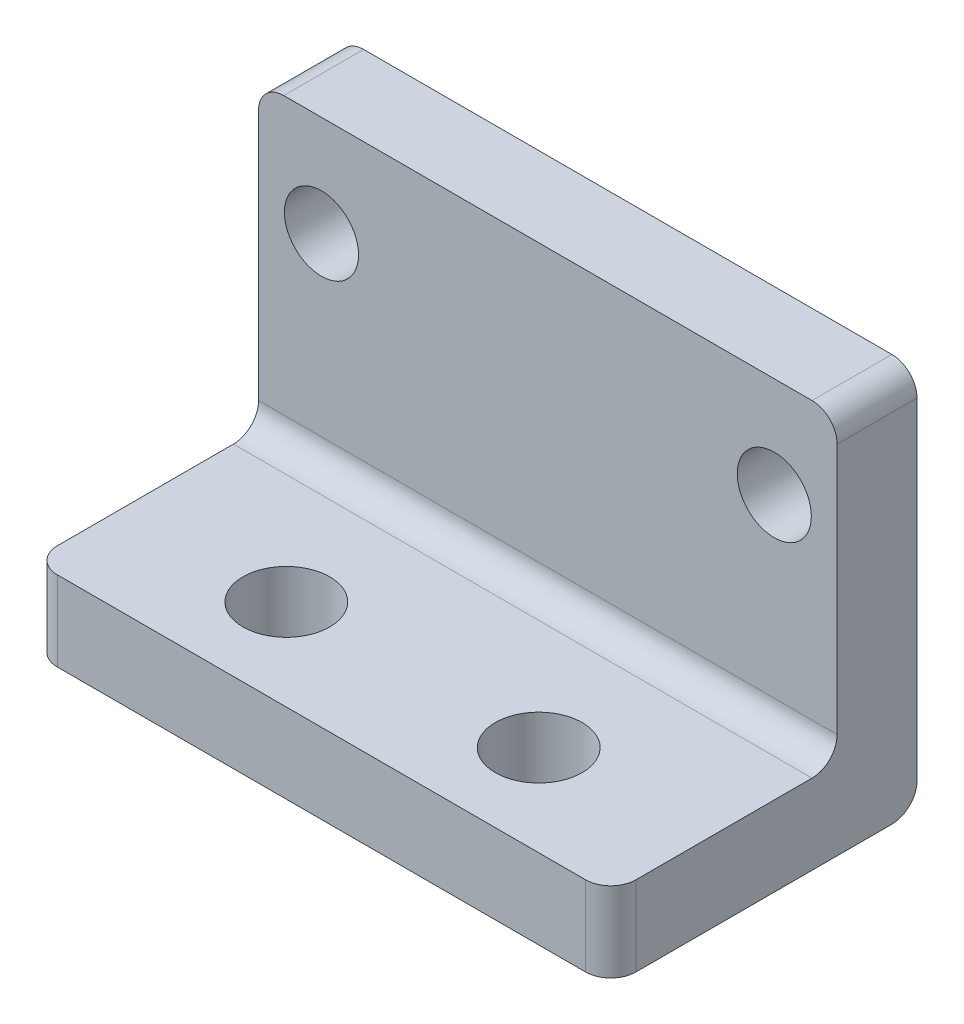
ISO-10303-21;
HEADER;
FILE_DESCRIPTION(('STEP AP214'),'2;1');
FILE_NAME('part.step','',(''),(''),'','','');
FILE_SCHEMA(('AUTOMOTIVE_DESIGN { 1 0 10303 214 1 1 1 1 }'));
ENDSEC;
DATA;
#1=APPLICATION_CONTEXT('core data for automotive mechanical design processes');
#2=APPLICATION_PROTOCOL_DEFINITION('international standard','automotive_design',2000,#1);
#3=PRODUCT_CONTEXT('',#1,'mechanical');
#4=PRODUCT('Part','Part','',(#3));
#5=PRODUCT_RELATED_PRODUCT_CATEGORY('part','',(#4));
#6=PRODUCT_DEFINITION_FORMATION('','',#4);
#7=PRODUCT_DEFINITION_CONTEXT('part definition',#1,'design');
#8=PRODUCT_DEFINITION('design','',#6,#7);
#9=PRODUCT_DEFINITION_SHAPE('','',#8);
#10=(LENGTH_UNIT() NAMED_UNIT(*) SI_UNIT(.MILLI.,.METRE.));
#11=(NAMED_UNIT(*) PLANE_ANGLE_UNIT() SI_UNIT($,.RADIAN.));
#12=(NAMED_UNIT(*) SI_UNIT($,.STERADIAN.) SOLID_ANGLE_UNIT());
#13=UNCERTAINTY_MEASURE_WITH_UNIT(LENGTH_MEASURE(1.E-05),#10,'distance_accuracy_value','');
#14=(GEOMETRIC_REPRESENTATION_CONTEXT(3) GLOBAL_UNCERTAINTY_ASSIGNED_CONTEXT((#13)) GLOBAL_UNIT_ASSIGNED_CONTEXT((#10,
#11,#12)) REPRESENTATION_CONTEXT('',''));
#15=CARTESIAN_POINT('',(0.,0.,0.));
#16=DIRECTION('',(0.,0.,1.));
#17=DIRECTION('',(1.,0.,0.));
#18=AXIS2_PLACEMENT_3D('',#15,#16,#17);
#19=CARTESIAN_POINT('',(23.,0.,3.175));
#20=DIRECTION('',(1.,0.,0.));
#21=DIRECTION('',(0.,0.,-1.));
#22=AXIS2_PLACEMENT_3D('',#19,#20,#21);
#23=PLANE('',#22);
#24=DIRECTION('',(0.,-1.,0.));
#25=VECTOR('',#24,1.);
#26=CARTESIAN_POINT('',(23.,0.,0.));
#27=LINE('',#26,#25);
#28=CARTESIAN_POINT('',(23.,1.,0.));
#29=VERTEX_POINT('',#28);
#30=CARTESIAN_POINT('',(23.,-12.175,0.));
#31=VERTEX_POINT('',#30);
#32=EDGE_CURVE('E163',#29,#31,#27,.T.);
#33=ORIENTED_EDGE('',*,*,#32,.F.);
#34=DIRECTION('',(0.,0.,-1.));
#35=VECTOR('',#34,1.);
#36=CARTESIAN_POINT('',(23.,1.,3.175));
#37=LINE('',#36,#35);
#38=CARTESIAN_POINT('',(23.,1.,3.175));
#39=VERTEX_POINT('',#38);
#40=EDGE_CURVE('E189',#29,#39,#37,.F.);
#41=ORIENTED_EDGE('',*,*,#40,.T.);
#42=DIRECTION('',(0.,-1.,0.));
#43=VECTOR('',#42,1.);
#44=CARTESIAN_POINT('',(23.,0.,3.175));
#45=LINE('',#44,#43);
#46=CARTESIAN_POINT('',(23.,-9.,3.175));
#47=VERTEX_POINT('',#46);
#48=EDGE_CURVE('E262',#39,#47,#45,.T.);
#49=ORIENTED_EDGE('',*,*,#48,.T.);
#50=CARTESIAN_POINT('',(23.,-9.,4.175));
#51=DIRECTION('',(1.,0.,0.));
#52=DIRECTION('',(0.,0.,-1.));
#53=AXIS2_PLACEMENT_3D('',#50,#51,#52);
#54=CIRCLE('',#53,1.);
#55=CARTESIAN_POINT('',(23.,-10.,4.175));
#56=VERTEX_POINT('',#55);
#57=EDGE_CURVE('E11',#47,#56,#54,.F.);
#58=ORIENTED_EDGE('',*,*,#57,.T.);
#59=DIRECTION('',(0.,0.,-1.));
#60=VECTOR('',#59,1.);
#61=CARTESIAN_POINT('',(23.,-10.,12.175));
#62=LINE('',#61,#60);
#63=CARTESIAN_POINT('',(23.,-10.,11.175));
#64=VERTEX_POINT('',#63);
#65=EDGE_CURVE('E260',#64,#56,#62,.T.);
#66=ORIENTED_EDGE('',*,*,#65,.F.);
#67=DIRECTION('',(0.,1.,0.));
#68=VECTOR('',#67,1.);
#69=CARTESIAN_POINT('',(23.,0.,11.175));
#70=LINE('',#69,#68);
#71=CARTESIAN_POINT('',(23.,-13.175,11.175));
#72=VERTEX_POINT('',#71);
#73=EDGE_CURVE('E186',#64,#72,#70,.F.);
#74=ORIENTED_EDGE('',*,*,#73,.T.);
#75=DIRECTION('',(0.,0.,-1.));
#76=VECTOR('',#75,1.);
#77=CARTESIAN_POINT('',(23.,-13.175,3.175));
#78=LINE('',#77,#76);
#79=CARTESIAN_POINT('',(23.,-13.175,1.));
#80=VERTEX_POINT('',#79);
#81=EDGE_CURVE('E175',#72,#80,#78,.T.);
#82=ORIENTED_EDGE('',*,*,#81,.T.);
#83=CARTESIAN_POINT('',(23.,-12.175,1.));
#84=DIRECTION('',(1.,0.,0.));
#85=DIRECTION('',(0.,0.,-1.));
#86=AXIS2_PLACEMENT_3D('',#83,#84,#85);
#87=CIRCLE('',#86,1.);
#88=EDGE_CURVE('E183',#80,#31,#87,.T.);
#89=ORIENTED_EDGE('',*,*,#88,.T.);
#90=EDGE_LOOP('',(#33,#41,#49,#58,#66,#74,#82,#89));
#91=FACE_BOUND('',#90,.T.);
#92=ADVANCED_FACE('F49',(#91),#23,.T.);
#93=CARTESIAN_POINT('',(0.,2.,3.175));
#94=DIRECTION('',(0.,1.,0.));
#95=DIRECTION('',(0.,0.,1.));
#96=AXIS2_PLACEMENT_3D('',#93,#94,#95);
#97=PLANE('',#96);
#98=DIRECTION('',(1.,0.,0.));
#99=VECTOR('',#98,1.);
#100=CARTESIAN_POINT('',(0.,2.,3.175));
#101=LINE('',#100,#99);
#102=CARTESIAN_POINT('',(1.,2.,3.175));
#103=VERTEX_POINT('',#102);
#104=CARTESIAN_POINT('',(22.,2.,3.175));
#105=VERTEX_POINT('',#104);
#106=EDGE_CURVE('E252',#103,#105,#101,.T.);
#107=ORIENTED_EDGE('',*,*,#106,.T.);
#108=DIRECTION('',(0.,0.,-1.));
#109=VECTOR('',#108,1.);
#110=CARTESIAN_POINT('',(22.,2.,3.175));
#111=LINE('',#110,#109);
#112=CARTESIAN_POINT('',(22.,2.,0.));
#113=VERTEX_POINT('',#112);
#114=EDGE_CURVE('E161',#105,#113,#111,.T.);
#115=ORIENTED_EDGE('',*,*,#114,.T.);
#116=DIRECTION('',(1.,0.,0.));
#117=VECTOR('',#116,1.);
#118=CARTESIAN_POINT('',(0.,2.,0.));
#119=LINE('',#118,#117);
#120=CARTESIAN_POINT('',(1.,2.,0.));
#121=VERTEX_POINT('',#120);
#122=EDGE_CURVE('E143',#121,#113,#119,.T.);
#123=ORIENTED_EDGE('',*,*,#122,.F.);
#124=DIRECTION('',(0.,0.,-1.));
#125=VECTOR('',#124,1.);
#126=CARTESIAN_POINT('',(1.,2.,3.175));
#127=LINE('',#126,#125);
#128=EDGE_CURVE('E158',#121,#103,#127,.F.);
#129=ORIENTED_EDGE('',*,*,#128,.T.);
#130=EDGE_LOOP('',(#107,#115,#123,#129));
#131=FACE_BOUND('',#130,.T.);
#132=ADVANCED_FACE('F157',(#131),#97,.T.);
#133=CARTESIAN_POINT('',(0.,0.,3.175));
#134=DIRECTION('',(1.,0.,0.));
#135=DIRECTION('',(0.,1.,0.));
#136=AXIS2_PLACEMENT_3D('',#133,#134,#135);
#137=PLANE('',#136);
#138=DIRECTION('',(0.,-1.,0.));
#139=VECTOR('',#138,1.);
#140=CARTESIAN_POINT('',(0.,0.,3.175));
#141=LINE('',#140,#139);
#142=CARTESIAN_POINT('',(0.,1.,3.175));
#143=VERTEX_POINT('',#142);
#144=CARTESIAN_POINT('',(0.,-9.,3.175));
#145=VERTEX_POINT('',#144);
#146=EDGE_CURVE('E240',#143,#145,#141,.T.);
#147=ORIENTED_EDGE('',*,*,#146,.F.);
#148=DIRECTION('',(0.,0.,-1.));
#149=VECTOR('',#148,1.);
#150=CARTESIAN_POINT('',(0.,1.,0.));
#151=LINE('',#150,#149);
#152=CARTESIAN_POINT('',(0.,1.,0.));
#153=VERTEX_POINT('',#152);
#154=EDGE_CURVE('E207',#143,#153,#151,.T.);
#155=ORIENTED_EDGE('',*,*,#154,.T.);
#156=DIRECTION('',(0.,-1.,0.));
#157=VECTOR('',#156,1.);
#158=CARTESIAN_POINT('',(0.,0.,0.));
#159=LINE('',#158,#157);
#160=CARTESIAN_POINT('',(0.,-12.175,0.));
#161=VERTEX_POINT('',#160);
#162=EDGE_CURVE('E145',#153,#161,#159,.T.);
#163=ORIENTED_EDGE('',*,*,#162,.T.);
#164=CARTESIAN_POINT('',(0.,-12.175,1.));
#165=DIRECTION('',(1.,0.,0.));
#166=DIRECTION('',(0.,1.,0.));
#167=AXIS2_PLACEMENT_3D('',#164,#165,#166);
#168=CIRCLE('',#167,1.);
#169=CARTESIAN_POINT('',(0.,-13.175,1.));
#170=VERTEX_POINT('',#169);
#171=EDGE_CURVE('E200',#161,#170,#168,.F.);
#172=ORIENTED_EDGE('',*,*,#171,.T.);
#173=DIRECTION('',(0.,0.,-1.));
#174=VECTOR('',#173,1.);
#175=CARTESIAN_POINT('',(0.,-13.175,3.175));
#176=LINE('',#175,#174);
#177=CARTESIAN_POINT('',(0.,-13.175,11.175));
#178=VERTEX_POINT('',#177);
#179=EDGE_CURVE('E169',#178,#170,#176,.T.);
#180=ORIENTED_EDGE('',*,*,#179,.F.);
#181=DIRECTION('',(0.,1.,0.));
#182=VECTOR('',#181,1.);
#183=CARTESIAN_POINT('',(0.,-10.,11.175));
#184=LINE('',#183,#182);
#185=CARTESIAN_POINT('',(0.,-10.,11.175));
#186=VERTEX_POINT('',#185);
#187=EDGE_CURVE('E203',#178,#186,#184,.T.);
#188=ORIENTED_EDGE('',*,*,#187,.T.);
#189=DIRECTION('',(0.,0.,-1.));
#190=VECTOR('',#189,1.);
#191=CARTESIAN_POINT('',(0.,-10.,12.175));
#192=LINE('',#191,#190);
#193=CARTESIAN_POINT('',(0.,-10.,4.175));
#194=VERTEX_POINT('',#193);
#195=EDGE_CURVE('E242',#186,#194,#192,.T.);
#196=ORIENTED_EDGE('',*,*,#195,.T.);
#197=CARTESIAN_POINT('',(0.,-9.,4.175));
#198=DIRECTION('',(1.,0.,0.));
#199=DIRECTION('',(0.,1.,0.));
#200=AXIS2_PLACEMENT_3D('',#197,#198,#199);
#201=CIRCLE('',#200,1.);
#202=EDGE_CURVE('E58',#194,#145,#201,.T.);
#203=ORIENTED_EDGE('',*,*,#202,.T.);
#204=EDGE_LOOP('',(#147,#155,#163,#172,#180,#188,#196,#203));
#205=FACE_BOUND('',#204,.T.);
#206=ADVANCED_FACE('F239',(#205),#137,.F.);
#207=CARTESIAN_POINT('',(2.5,-2.,3.175));
#208=DIRECTION('',(0.,0.,-1.));
#209=DIRECTION('',(-1.,0.,0.));
#210=AXIS2_PLACEMENT_3D('',#207,#208,#209);
#211=CYLINDRICAL_SURFACE('',#210,1.4732);
#212=CARTESIAN_POINT('',(2.5,-2.,3.175));
#213=DIRECTION('',(0.,0.,1.));
#214=DIRECTION('',(1.,0.,0.));
#215=AXIS2_PLACEMENT_3D('',#212,#213,#214);
#216=CIRCLE('',#215,1.4732);
#217=CARTESIAN_POINT('',(3.9732,-2.,3.175));
#218=VERTEX_POINT('',#217);
#219=EDGE_CURVE('E283',#218,#218,#216,.T.);
#220=ORIENTED_EDGE('',*,*,#219,.T.);
#221=EDGE_LOOP('',(#220));
#222=FACE_BOUND('',#221,.T.);
#223=CARTESIAN_POINT('',(2.5,-2.,0.));
#224=DIRECTION('',(0.,0.,1.));
#225=DIRECTION('',(1.,0.,0.));
#226=AXIS2_PLACEMENT_3D('',#223,#224,#225);
#227=CIRCLE('',#226,1.4732);
#228=CARTESIAN_POINT('',(3.9732,-2.,0.));
#229=VERTEX_POINT('',#228);
#230=EDGE_CURVE('E272',#229,#229,#227,.T.);
#231=ORIENTED_EDGE('',*,*,#230,.F.);
#232=EDGE_LOOP('',(#231));
#233=FACE_BOUND('',#232,.T.);
#234=ADVANCED_FACE('F355',(#222,#233),#211,.F.);
#235=CARTESIAN_POINT('',(20.5,-2.,3.175));
#236=DIRECTION('',(0.,0.,-1.));
#237=DIRECTION('',(-1.,0.,0.));
#238=AXIS2_PLACEMENT_3D('',#235,#236,#237);
#239=CYLINDRICAL_SURFACE('',#238,1.4732);
#240=CARTESIAN_POINT('',(20.5,-2.,3.175));
#241=DIRECTION('',(0.,0.,1.));
#242=DIRECTION('',(1.,0.,0.));
#243=AXIS2_PLACEMENT_3D('',#240,#241,#242);
#244=CIRCLE('',#243,1.4732);
#245=CARTESIAN_POINT('',(21.9732,-2.,3.175));
#246=VERTEX_POINT('',#245);
#247=EDGE_CURVE('E279',#246,#246,#244,.T.);
#248=ORIENTED_EDGE('',*,*,#247,.T.);
#249=EDGE_LOOP('',(#248));
#250=FACE_BOUND('',#249,.T.);
#251=CARTESIAN_POINT('',(20.5,-2.,0.));
#252=DIRECTION('',(0.,0.,1.));
#253=DIRECTION('',(1.,0.,0.));
#254=AXIS2_PLACEMENT_3D('',#251,#252,#253);
#255=CIRCLE('',#254,1.4732);
#256=CARTESIAN_POINT('',(21.9732,-2.,0.));
#257=VERTEX_POINT('',#256);
#258=EDGE_CURVE('E267',#257,#257,#255,.T.);
#259=ORIENTED_EDGE('',*,*,#258,.F.);
#260=EDGE_LOOP('',(#259));
#261=FACE_BOUND('',#260,.T.);
#262=ADVANCED_FACE('F358',(#250,#261),#239,.F.);
#263=CARTESIAN_POINT('',(0.,-13.175,3.175));
#264=DIRECTION('',(0.,1.,0.));
#265=DIRECTION('',(0.,0.,1.));
#266=AXIS2_PLACEMENT_3D('',#263,#264,#265);
#267=PLANE('',#266);
#268=CARTESIAN_POINT('',(6.4835,-13.175,8.5555));
#269=DIRECTION('',(0.,1.,0.));
#270=DIRECTION('',(0.,0.,1.));
#271=AXIS2_PLACEMENT_3D('',#268,#269,#270);
#272=CIRCLE('',#271,1.7272);
#273=CARTESIAN_POINT('',(6.4835,-13.175,10.2827));
#274=VERTEX_POINT('',#273);
#275=EDGE_CURVE('E318',#274,#274,#272,.T.);
#276=ORIENTED_EDGE('',*,*,#275,.T.);
#277=EDGE_LOOP('',(#276));
#278=FACE_BOUND('',#277,.T.);
#279=CARTESIAN_POINT('',(16.5165,-13.175,8.5555));
#280=DIRECTION('',(0.,1.,0.));
#281=DIRECTION('',(0.,0.,1.));
#282=AXIS2_PLACEMENT_3D('',#279,#280,#281);
#283=CIRCLE('',#282,1.7272);
#284=CARTESIAN_POINT('',(16.5165,-13.175,10.2827));
#285=VERTEX_POINT('',#284);
#286=EDGE_CURVE('E308',#285,#285,#283,.T.);
#287=ORIENTED_EDGE('',*,*,#286,.T.);
#288=EDGE_LOOP('',(#287));
#289=FACE_BOUND('',#288,.T.);
#290=DIRECTION('',(-1.,0.,0.));
#291=VECTOR('',#290,1.);
#292=CARTESIAN_POINT('',(0.,-13.175,12.175));
#293=LINE('',#292,#291);
#294=CARTESIAN_POINT('',(22.,-13.175,12.175));
#295=VERTEX_POINT('',#294);
#296=CARTESIAN_POINT('',(1.,-13.175,12.175));
#297=VERTEX_POINT('',#296);
#298=EDGE_CURVE('E274',#295,#297,#293,.T.);
#299=ORIENTED_EDGE('',*,*,#298,.T.);
#300=CARTESIAN_POINT('',(1.,-13.175,11.175));
#301=DIRECTION('',(0.,1.,0.));
#302=DIRECTION('',(0.,0.,1.));
#303=AXIS2_PLACEMENT_3D('',#300,#301,#302);
#304=CIRCLE('',#303,1.);
#305=EDGE_CURVE('E232',#297,#178,#304,.F.);
#306=ORIENTED_EDGE('',*,*,#305,.T.);
#307=ORIENTED_EDGE('',*,*,#179,.T.);
#308=DIRECTION('',(1.,0.,0.));
#309=VECTOR('',#308,1.);
#310=CARTESIAN_POINT('',(0.,-13.175,1.));
#311=LINE('',#310,#309);
#312=EDGE_CURVE('E226',#170,#80,#311,.T.);
#313=ORIENTED_EDGE('',*,*,#312,.T.);
#314=ORIENTED_EDGE('',*,*,#81,.F.);
#315=CARTESIAN_POINT('',(22.,-13.175,11.175));
#316=DIRECTION('',(0.,1.,0.));
#317=DIRECTION('',(0.,0.,1.));
#318=AXIS2_PLACEMENT_3D('',#315,#316,#317);
#319=CIRCLE('',#318,1.);
#320=EDGE_CURVE('E72',#72,#295,#319,.F.);
#321=ORIENTED_EDGE('',*,*,#320,.T.);
#322=EDGE_LOOP('',(#299,#306,#307,#313,#314,#321));
#323=FACE_BOUND('',#322,.T.);
#324=ADVANCED_FACE('F300',(#278,#289,#323),#267,.F.);
#325=CARTESIAN_POINT('',(0.,0.,3.175));
#326=DIRECTION('',(0.,0.,1.));
#327=DIRECTION('',(1.,0.,0.));
#328=AXIS2_PLACEMENT_3D('',#325,#326,#327);
#329=PLANE('',#328);
#330=ORIENTED_EDGE('',*,*,#48,.F.);
#331=CARTESIAN_POINT('',(22.,1.,3.175));
#332=DIRECTION('',(0.,0.,1.));
#333=DIRECTION('',(1.,0.,0.));
#334=AXIS2_PLACEMENT_3D('',#331,#332,#333);
#335=CIRCLE('',#334,1.);
#336=EDGE_CURVE('E197',#39,#105,#335,.T.);
#337=ORIENTED_EDGE('',*,*,#336,.T.);
#338=ORIENTED_EDGE('',*,*,#106,.F.);
#339=CARTESIAN_POINT('',(1.,1.,3.175));
#340=DIRECTION('',(0.,0.,1.));
#341=DIRECTION('',(1.,0.,0.));
#342=AXIS2_PLACEMENT_3D('',#339,#340,#341);
#343=CIRCLE('',#342,1.);
#344=EDGE_CURVE('E167',#103,#143,#343,.T.);
#345=ORIENTED_EDGE('',*,*,#344,.T.);
#346=ORIENTED_EDGE('',*,*,#146,.T.);
#347=DIRECTION('',(-1.,0.,0.));
#348=VECTOR('',#347,1.);
#349=CARTESIAN_POINT('',(0.,-9.,3.175));
#350=LINE('',#349,#348);
#351=EDGE_CURVE('E192',#145,#47,#350,.F.);
#352=ORIENTED_EDGE('',*,*,#351,.T.);
#353=EDGE_LOOP('',(#330,#337,#338,#345,#346,#352));
#354=FACE_BOUND('',#353,.T.);
#355=ORIENTED_EDGE('',*,*,#247,.F.);
#356=EDGE_LOOP('',(#355));
#357=FACE_BOUND('',#356,.T.);
#358=ORIENTED_EDGE('',*,*,#219,.F.);
#359=EDGE_LOOP('',(#358));
#360=FACE_BOUND('',#359,.T.);
#361=ADVANCED_FACE('F248',(#354,#357,#360),#329,.T.);
#362=CARTESIAN_POINT('',(0.,0.,0.));
#363=DIRECTION('',(0.,0.,1.));
#364=DIRECTION('',(1.,0.,0.));
#365=AXIS2_PLACEMENT_3D('',#362,#363,#364);
#366=PLANE('',#365);
#367=ORIENTED_EDGE('',*,*,#258,.T.);
#368=EDGE_LOOP('',(#367));
#369=FACE_BOUND('',#368,.T.);
#370=ORIENTED_EDGE('',*,*,#230,.T.);
#371=EDGE_LOOP('',(#370));
#372=FACE_BOUND('',#371,.T.);
#373=ORIENTED_EDGE('',*,*,#122,.T.);
#374=CARTESIAN_POINT('',(22.,1.,0.));
#375=DIRECTION('',(0.,0.,1.));
#376=DIRECTION('',(1.,0.,0.));
#377=AXIS2_PLACEMENT_3D('',#374,#375,#376);
#378=CIRCLE('',#377,1.);
#379=EDGE_CURVE('E151',#113,#29,#378,.F.);
#380=ORIENTED_EDGE('',*,*,#379,.T.);
#381=ORIENTED_EDGE('',*,*,#32,.T.);
#382=DIRECTION('',(1.,0.,0.));
#383=VECTOR('',#382,1.);
#384=CARTESIAN_POINT('',(0.,-12.175,0.));
#385=LINE('',#384,#383);
#386=EDGE_CURVE('E152',#31,#161,#385,.F.);
#387=ORIENTED_EDGE('',*,*,#386,.T.);
#388=ORIENTED_EDGE('',*,*,#162,.F.);
#389=CARTESIAN_POINT('',(1.,1.,0.));
#390=DIRECTION('',(0.,0.,1.));
#391=DIRECTION('',(1.,0.,0.));
#392=AXIS2_PLACEMENT_3D('',#389,#390,#391);
#393=CIRCLE('',#392,1.);
#394=EDGE_CURVE('E140',#153,#121,#393,.F.);
#395=ORIENTED_EDGE('',*,*,#394,.T.);
#396=EDGE_LOOP('',(#373,#380,#381,#387,#388,#395));
#397=FACE_BOUND('',#396,.T.);
#398=ADVANCED_FACE('F142',(#369,#372,#397),#366,.F.);
#399=CARTESIAN_POINT('',(0.,-10.,12.175));
#400=DIRECTION('',(0.,-1.,0.));
#401=DIRECTION('',(1.,0.,0.));
#402=AXIS2_PLACEMENT_3D('',#399,#400,#401);
#403=PLANE('',#402);
#404=CARTESIAN_POINT('',(6.4835,-10.,8.5555));
#405=DIRECTION('',(0.,1.,0.));
#406=DIRECTION('',(0.,0.,1.));
#407=AXIS2_PLACEMENT_3D('',#404,#405,#406);
#408=CIRCLE('',#407,1.7272);
#409=CARTESIAN_POINT('',(6.4835,-10.,10.2827));
#410=VERTEX_POINT('',#409);
#411=EDGE_CURVE('E322',#410,#410,#408,.T.);
#412=ORIENTED_EDGE('',*,*,#411,.F.);
#413=EDGE_LOOP('',(#412));
#414=FACE_BOUND('',#413,.T.);
#415=CARTESIAN_POINT('',(16.5165,-10.,8.5555));
#416=DIRECTION('',(0.,1.,0.));
#417=DIRECTION('',(0.,0.,1.));
#418=AXIS2_PLACEMENT_3D('',#415,#416,#417);
#419=CIRCLE('',#418,1.7272);
#420=CARTESIAN_POINT('',(16.5165,-10.,10.2827));
#421=VERTEX_POINT('',#420);
#422=EDGE_CURVE('E312',#421,#421,#419,.T.);
#423=ORIENTED_EDGE('',*,*,#422,.F.);
#424=EDGE_LOOP('',(#423));
#425=FACE_BOUND('',#424,.T.);
#426=ORIENTED_EDGE('',*,*,#65,.T.);
#427=DIRECTION('',(-1.,0.,0.));
#428=VECTOR('',#427,1.);
#429=CARTESIAN_POINT('',(0.,-10.,4.175));
#430=LINE('',#429,#428);
#431=EDGE_CURVE('E216',#56,#194,#430,.T.);
#432=ORIENTED_EDGE('',*,*,#431,.T.);
#433=ORIENTED_EDGE('',*,*,#195,.F.);
#434=CARTESIAN_POINT('',(1.,-10.,11.175));
#435=DIRECTION('',(0.,-1.,0.));
#436=DIRECTION('',(1.,0.,0.));
#437=AXIS2_PLACEMENT_3D('',#434,#435,#436);
#438=CIRCLE('',#437,1.);
#439=CARTESIAN_POINT('',(1.,-10.,12.175));
#440=VERTEX_POINT('',#439);
#441=EDGE_CURVE('E213',#186,#440,#438,.F.);
#442=ORIENTED_EDGE('',*,*,#441,.T.);
#443=DIRECTION('',(-1.,0.,0.));
#444=VECTOR('',#443,1.);
#445=CARTESIAN_POINT('',(0.,-10.,12.175));
#446=LINE('',#445,#444);
#447=CARTESIAN_POINT('',(22.,-10.,12.175));
#448=VERTEX_POINT('',#447);
#449=EDGE_CURVE('E306',#448,#440,#446,.T.);
#450=ORIENTED_EDGE('',*,*,#449,.F.);
#451=CARTESIAN_POINT('',(22.,-10.,11.175));
#452=DIRECTION('',(0.,-1.,0.));
#453=DIRECTION('',(1.,0.,0.));
#454=AXIS2_PLACEMENT_3D('',#451,#452,#453);
#455=CIRCLE('',#454,1.);
#456=EDGE_CURVE('E210',#448,#64,#455,.F.);
#457=ORIENTED_EDGE('',*,*,#456,.T.);
#458=EDGE_LOOP('',(#426,#432,#433,#442,#450,#457));
#459=FACE_BOUND('',#458,.T.);
#460=ADVANCED_FACE('F264',(#414,#425,#459),#403,.F.);
#461=CARTESIAN_POINT('',(0.,0.,12.175));
#462=DIRECTION('',(0.,0.,1.));
#463=DIRECTION('',(1.,0.,0.));
#464=AXIS2_PLACEMENT_3D('',#461,#462,#463);
#465=PLANE('',#464);
#466=ORIENTED_EDGE('',*,*,#449,.T.);
#467=DIRECTION('',(0.,1.,0.));
#468=VECTOR('',#467,1.);
#469=CARTESIAN_POINT('',(1.,-13.175,12.175));
#470=LINE('',#469,#468);
#471=EDGE_CURVE('E65',#440,#297,#470,.F.);
#472=ORIENTED_EDGE('',*,*,#471,.T.);
#473=ORIENTED_EDGE('',*,*,#298,.F.);
#474=DIRECTION('',(0.,1.,0.));
#475=VECTOR('',#474,1.);
#476=CARTESIAN_POINT('',(22.,0.,12.175));
#477=LINE('',#476,#475);
#478=EDGE_CURVE('E220',#295,#448,#477,.T.);
#479=ORIENTED_EDGE('',*,*,#478,.T.);
#480=EDGE_LOOP('',(#466,#472,#473,#479));
#481=FACE_BOUND('',#480,.T.);
#482=ADVANCED_FACE('F305',(#481),#465,.T.);
#483=CARTESIAN_POINT('',(16.5165,-10.,8.5555));
#484=DIRECTION('',(0.,1.,0.));
#485=DIRECTION('',(0.,0.,1.));
#486=AXIS2_PLACEMENT_3D('',#483,#484,#485);
#487=CYLINDRICAL_SURFACE('',#486,1.7272);
#488=ORIENTED_EDGE('',*,*,#286,.F.);
#489=EDGE_LOOP('',(#488));
#490=FACE_BOUND('',#489,.T.);
#491=ORIENTED_EDGE('',*,*,#422,.T.);
#492=EDGE_LOOP('',(#491));
#493=FACE_BOUND('',#492,.T.);
#494=ADVANCED_FACE('F334',(#490,#493),#487,.F.);
#495=CARTESIAN_POINT('',(6.4835,-10.,8.5555));
#496=DIRECTION('',(0.,1.,0.));
#497=DIRECTION('',(0.,0.,1.));
#498=AXIS2_PLACEMENT_3D('',#495,#496,#497);
#499=CYLINDRICAL_SURFACE('',#498,1.7272);
#500=ORIENTED_EDGE('',*,*,#275,.F.);
#501=EDGE_LOOP('',(#500));
#502=FACE_BOUND('',#501,.T.);
#503=ORIENTED_EDGE('',*,*,#411,.T.);
#504=EDGE_LOOP('',(#503));
#505=FACE_BOUND('',#504,.T.);
#506=ADVANCED_FACE('F327',(#502,#505),#499,.F.);
#507=CARTESIAN_POINT('',(22.,1.,3.175));
#508=DIRECTION('',(0.,0.,-1.));
#509=DIRECTION('',(-1.,0.,0.));
#510=AXIS2_PLACEMENT_3D('',#507,#508,#509);
#511=CYLINDRICAL_SURFACE('',#510,1.);
#512=ORIENTED_EDGE('',*,*,#336,.F.);
#513=ORIENTED_EDGE('',*,*,#40,.F.);
#514=ORIENTED_EDGE('',*,*,#379,.F.);
#515=ORIENTED_EDGE('',*,*,#114,.F.);
#516=EDGE_LOOP('',(#512,#513,#514,#515));
#517=FACE_BOUND('',#516,.T.);
#518=ADVANCED_FACE('F342',(#517),#511,.T.);
#519=CARTESIAN_POINT('',(1.,1.,3.175));
#520=DIRECTION('',(0.,0.,1.));
#521=DIRECTION('',(1.,0.,0.));
#522=AXIS2_PLACEMENT_3D('',#519,#520,#521);
#523=CYLINDRICAL_SURFACE('',#522,1.);
#524=ORIENTED_EDGE('',*,*,#344,.F.);
#525=ORIENTED_EDGE('',*,*,#128,.F.);
#526=ORIENTED_EDGE('',*,*,#394,.F.);
#527=ORIENTED_EDGE('',*,*,#154,.F.);
#528=EDGE_LOOP('',(#524,#525,#526,#527));
#529=FACE_BOUND('',#528,.T.);
#530=ADVANCED_FACE('F166',(#529),#523,.T.);
#531=CARTESIAN_POINT('',(0.,-9.,4.175));
#532=DIRECTION('',(-1.,0.,0.));
#533=DIRECTION('',(0.,-1.,0.));
#534=AXIS2_PLACEMENT_3D('',#531,#532,#533);
#535=CYLINDRICAL_SURFACE('',#534,1.);
#536=ORIENTED_EDGE('',*,*,#57,.F.);
#537=ORIENTED_EDGE('',*,*,#351,.F.);
#538=ORIENTED_EDGE('',*,*,#202,.F.);
#539=ORIENTED_EDGE('',*,*,#431,.F.);
#540=EDGE_LOOP('',(#536,#537,#538,#539));
#541=FACE_BOUND('',#540,.T.);
#542=ADVANCED_FACE('F255',(#541),#535,.F.);
#543=CARTESIAN_POINT('',(1.,0.,11.175));
#544=DIRECTION('',(0.,-1.,0.));
#545=DIRECTION('',(1.,0.,0.));
#546=AXIS2_PLACEMENT_3D('',#543,#544,#545);
#547=CYLINDRICAL_SURFACE('',#546,1.);
#548=ORIENTED_EDGE('',*,*,#305,.F.);
#549=ORIENTED_EDGE('',*,*,#471,.F.);
#550=ORIENTED_EDGE('',*,*,#441,.F.);
#551=ORIENTED_EDGE('',*,*,#187,.F.);
#552=EDGE_LOOP('',(#548,#549,#550,#551));
#553=FACE_BOUND('',#552,.T.);
#554=ADVANCED_FACE('F370',(#553),#547,.T.);
#555=CARTESIAN_POINT('',(22.,0.,11.175));
#556=DIRECTION('',(0.,1.,0.));
#557=DIRECTION('',(0.,0.,1.));
#558=AXIS2_PLACEMENT_3D('',#555,#556,#557);
#559=CYLINDRICAL_SURFACE('',#558,1.);
#560=ORIENTED_EDGE('',*,*,#320,.F.);
#561=ORIENTED_EDGE('',*,*,#73,.F.);
#562=ORIENTED_EDGE('',*,*,#456,.F.);
#563=ORIENTED_EDGE('',*,*,#478,.F.);
#564=EDGE_LOOP('',(#560,#561,#562,#563));
#565=FACE_BOUND('',#564,.T.);
#566=ADVANCED_FACE('F304',(#565),#559,.T.);
#567=CARTESIAN_POINT('',(0.,-12.175,1.));
#568=DIRECTION('',(1.,0.,0.));
#569=DIRECTION('',(0.,0.,-1.));
#570=AXIS2_PLACEMENT_3D('',#567,#568,#569);
#571=CYLINDRICAL_SURFACE('',#570,1.);
#572=ORIENTED_EDGE('',*,*,#171,.F.);
#573=ORIENTED_EDGE('',*,*,#386,.F.);
#574=ORIENTED_EDGE('',*,*,#88,.F.);
#575=ORIENTED_EDGE('',*,*,#312,.F.);
#576=EDGE_LOOP('',(#572,#573,#574,#575));
#577=FACE_BOUND('',#576,.T.);
#578=ADVANCED_FACE('F51',(#577),#571,.T.);
#579=CLOSED_SHELL('',(#92,#132,#206,#234,#262,#324,#361,#398,#460,#482,#494,#506,#518,#530,#542,
#554,#566,#578));
#580=MANIFOLD_SOLID_BREP('B2',#579);
#581=ADVANCED_BREP_SHAPE_REPRESENTATION('',(#18,#580),#14);
#582=SHAPE_DEFINITION_REPRESENTATION(#9,#581);
ENDSEC;
END-ISO-10303-21;
